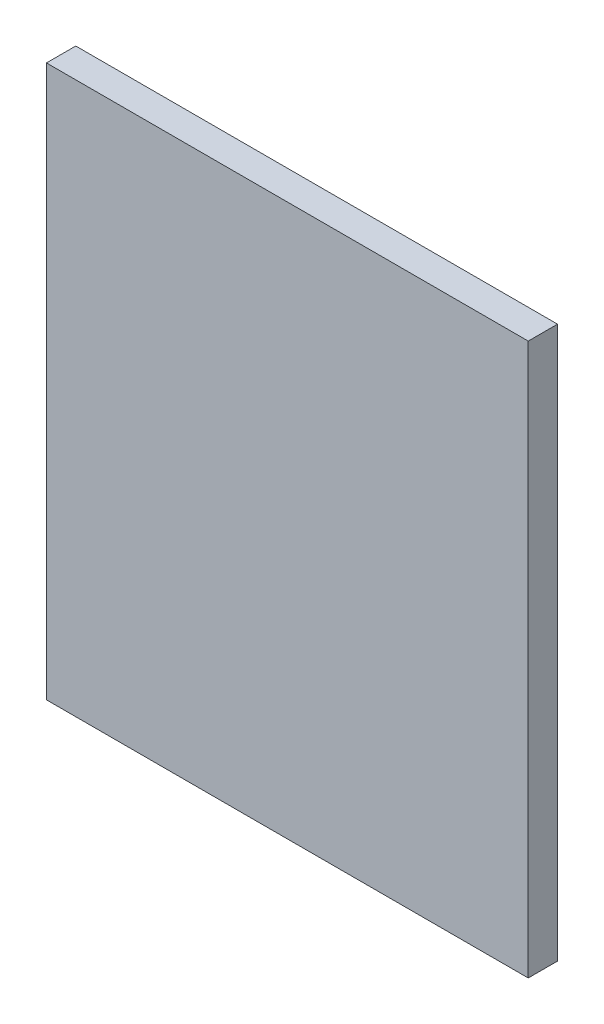
ISO-10303-21;
HEADER;
FILE_DESCRIPTION(('STEP AP214'),'2;1');
FILE_NAME('part.step','',(''),(''),'','','');
FILE_SCHEMA(('AUTOMOTIVE_DESIGN { 1 0 10303 214 1 1 1 1 }'));
ENDSEC;
DATA;
#1=APPLICATION_CONTEXT('core data for automotive mechanical design processes');
#2=APPLICATION_PROTOCOL_DEFINITION('international standard','automotive_design',2000,#1);
#3=PRODUCT_CONTEXT('',#1,'mechanical');
#4=PRODUCT('Part','Part','',(#3));
#5=PRODUCT_RELATED_PRODUCT_CATEGORY('part','',(#4));
#6=PRODUCT_DEFINITION_FORMATION('','',#4);
#7=PRODUCT_DEFINITION_CONTEXT('part definition',#1,'design');
#8=PRODUCT_DEFINITION('design','',#6,#7);
#9=PRODUCT_DEFINITION_SHAPE('','',#8);
#10=(LENGTH_UNIT() NAMED_UNIT(*) SI_UNIT(.MILLI.,.METRE.));
#11=(NAMED_UNIT(*) PLANE_ANGLE_UNIT() SI_UNIT($,.RADIAN.));
#12=(NAMED_UNIT(*) SI_UNIT($,.STERADIAN.) SOLID_ANGLE_UNIT());
#13=UNCERTAINTY_MEASURE_WITH_UNIT(LENGTH_MEASURE(1.E-05),#10,'distance_accuracy_value','');
#14=(GEOMETRIC_REPRESENTATION_CONTEXT(3) GLOBAL_UNCERTAINTY_ASSIGNED_CONTEXT((#13)) GLOBAL_UNIT_ASSIGNED_CONTEXT((#10,
#11,#12)) REPRESENTATION_CONTEXT('',''));
#15=CARTESIAN_POINT('',(0.,0.,0.));
#16=DIRECTION('',(0.,0.,1.));
#17=DIRECTION('',(1.,0.,0.));
#18=AXIS2_PLACEMENT_3D('',#15,#16,#17);
#19=CARTESIAN_POINT('',(-43.4932132571721,38.6076742337637,1.));
#20=DIRECTION('',(1.,0.,0.));
#21=DIRECTION('',(0.,0.,-1.));
#22=AXIS2_PLACEMENT_3D('',#19,#20,#21);
#23=PLANE('',#22);
#24=DIRECTION('',(0.,-1.,0.));
#25=VECTOR('',#24,1.);
#26=CARTESIAN_POINT('',(-43.4932132571721,38.6076742337637,0.));
#27=LINE('',#26,#25);
#28=CARTESIAN_POINT('',(-43.4932132571721,38.6076742337637,0.));
#29=VERTEX_POINT('',#28);
#30=CARTESIAN_POINT('',(-43.4932132571721,19.7804750703851,0.));
#31=VERTEX_POINT('',#30);
#32=EDGE_CURVE('E96',#29,#31,#27,.T.);
#33=ORIENTED_EDGE('',*,*,#32,.T.);
#34=DIRECTION('',(0.,0.,-1.));
#35=VECTOR('',#34,1.);
#36=CARTESIAN_POINT('',(-43.4932132571721,19.7804750703851,1.));
#37=LINE('',#36,#35);
#38=CARTESIAN_POINT('',(-43.4932132571721,19.7804750703851,1.));
#39=VERTEX_POINT('',#38);
#40=EDGE_CURVE('E11',#39,#31,#37,.T.);
#41=ORIENTED_EDGE('',*,*,#40,.F.);
#42=DIRECTION('',(0.,-1.,0.));
#43=VECTOR('',#42,1.);
#44=CARTESIAN_POINT('',(-43.4932132571721,38.6076742337637,1.));
#45=LINE('',#44,#43);
#46=CARTESIAN_POINT('',(-43.4932132571721,38.6076742337637,1.));
#47=VERTEX_POINT('',#46);
#48=EDGE_CURVE('E84',#47,#39,#45,.T.);
#49=ORIENTED_EDGE('',*,*,#48,.F.);
#50=DIRECTION('',(0.,0.,-1.));
#51=VECTOR('',#50,1.);
#52=CARTESIAN_POINT('',(-43.4932132571721,38.6076742337637,1.));
#53=LINE('',#52,#51);
#54=EDGE_CURVE('E92',#47,#29,#53,.T.);
#55=ORIENTED_EDGE('',*,*,#54,.T.);
#56=EDGE_LOOP('',(#33,#41,#49,#55));
#57=FACE_BOUND('',#56,.T.);
#58=ADVANCED_FACE('F33',(#57),#23,.F.);
#59=CARTESIAN_POINT('',(-43.4932132571721,19.7804750703851,1.));
#60=DIRECTION('',(0.,1.,0.));
#61=DIRECTION('',(0.,0.,1.));
#62=AXIS2_PLACEMENT_3D('',#59,#60,#61);
#63=PLANE('',#62);
#64=DIRECTION('',(1.,0.,0.));
#65=VECTOR('',#64,1.);
#66=CARTESIAN_POINT('',(-43.4932132571721,19.7804750703851,0.));
#67=LINE('',#66,#65);
#68=CARTESIAN_POINT('',(-27.0492038613097,19.7804750703851,0.));
#69=VERTEX_POINT('',#68);
#70=EDGE_CURVE('E88',#31,#69,#67,.T.);
#71=ORIENTED_EDGE('',*,*,#70,.T.);
#72=DIRECTION('',(0.,0.,-1.));
#73=VECTOR('',#72,1.);
#74=CARTESIAN_POINT('',(-27.0492038613097,19.7804750703851,1.));
#75=LINE('',#74,#73);
#76=CARTESIAN_POINT('',(-27.0492038613097,19.7804750703851,1.));
#77=VERTEX_POINT('',#76);
#78=EDGE_CURVE('E41',#77,#69,#75,.T.);
#79=ORIENTED_EDGE('',*,*,#78,.F.);
#80=DIRECTION('',(1.,0.,0.));
#81=VECTOR('',#80,1.);
#82=CARTESIAN_POINT('',(-43.4932132571721,19.7804750703851,1.));
#83=LINE('',#82,#81);
#84=EDGE_CURVE('E79',#39,#77,#83,.T.);
#85=ORIENTED_EDGE('',*,*,#84,.F.);
#86=ORIENTED_EDGE('',*,*,#40,.T.);
#87=EDGE_LOOP('',(#71,#79,#85,#86));
#88=FACE_BOUND('',#87,.T.);
#89=ADVANCED_FACE('F87',(#88),#63,.F.);
#90=CARTESIAN_POINT('',(-27.0492038613097,38.6076742337637,1.));
#91=DIRECTION('',(-1.,0.,0.));
#92=DIRECTION('',(0.,0.,1.));
#93=AXIS2_PLACEMENT_3D('',#90,#91,#92);
#94=PLANE('',#93);
#95=DIRECTION('',(0.,1.,0.));
#96=VECTOR('',#95,1.);
#97=CARTESIAN_POINT('',(-27.0492038613097,38.6076742337637,0.));
#98=LINE('',#97,#96);
#99=CARTESIAN_POINT('',(-27.0492038613097,38.6076742337637,0.));
#100=VERTEX_POINT('',#99);
#101=EDGE_CURVE('E66',#69,#100,#98,.T.);
#102=ORIENTED_EDGE('',*,*,#101,.T.);
#103=DIRECTION('',(0.,0.,-1.));
#104=VECTOR('',#103,1.);
#105=CARTESIAN_POINT('',(-27.0492038613097,38.6076742337637,1.));
#106=LINE('',#105,#104);
#107=CARTESIAN_POINT('',(-27.0492038613097,38.6076742337637,1.));
#108=VERTEX_POINT('',#107);
#109=EDGE_CURVE('E89',#108,#100,#106,.T.);
#110=ORIENTED_EDGE('',*,*,#109,.F.);
#111=DIRECTION('',(0.,1.,0.));
#112=VECTOR('',#111,1.);
#113=CARTESIAN_POINT('',(-27.0492038613097,38.6076742337637,1.));
#114=LINE('',#113,#112);
#115=EDGE_CURVE('E82',#77,#108,#114,.T.);
#116=ORIENTED_EDGE('',*,*,#115,.F.);
#117=ORIENTED_EDGE('',*,*,#78,.T.);
#118=EDGE_LOOP('',(#102,#110,#116,#117));
#119=FACE_BOUND('',#118,.T.);
#120=ADVANCED_FACE('F90',(#119),#94,.F.);
#121=CARTESIAN_POINT('',(-43.4932132571721,38.6076742337637,1.));
#122=DIRECTION('',(0.,-1.,0.));
#123=DIRECTION('',(0.,0.,-1.));
#124=AXIS2_PLACEMENT_3D('',#121,#122,#123);
#125=PLANE('',#124);
#126=DIRECTION('',(-1.,0.,0.));
#127=VECTOR('',#126,1.);
#128=CARTESIAN_POINT('',(-43.4932132571721,38.6076742337637,0.));
#129=LINE('',#128,#127);
#130=EDGE_CURVE('E72',#100,#29,#129,.T.);
#131=ORIENTED_EDGE('',*,*,#130,.T.);
#132=ORIENTED_EDGE('',*,*,#54,.F.);
#133=DIRECTION('',(-1.,0.,0.));
#134=VECTOR('',#133,1.);
#135=CARTESIAN_POINT('',(-43.4932132571721,38.6076742337637,1.));
#136=LINE('',#135,#134);
#137=EDGE_CURVE('E49',#108,#47,#136,.T.);
#138=ORIENTED_EDGE('',*,*,#137,.F.);
#139=ORIENTED_EDGE('',*,*,#109,.T.);
#140=EDGE_LOOP('',(#131,#132,#138,#139));
#141=FACE_BOUND('',#140,.T.);
#142=ADVANCED_FACE('F103',(#141),#125,.F.);
#143=CARTESIAN_POINT('',(0.,0.,1.));
#144=DIRECTION('',(0.,0.,1.));
#145=DIRECTION('',(1.,0.,0.));
#146=AXIS2_PLACEMENT_3D('',#143,#144,#145);
#147=PLANE('',#146);
#148=ORIENTED_EDGE('',*,*,#48,.T.);
#149=ORIENTED_EDGE('',*,*,#84,.T.);
#150=ORIENTED_EDGE('',*,*,#115,.T.);
#151=ORIENTED_EDGE('',*,*,#137,.T.);
#152=EDGE_LOOP('',(#148,#149,#150,#151));
#153=FACE_BOUND('',#152,.T.);
#154=ADVANCED_FACE('F80',(#153),#147,.T.);
#155=CARTESIAN_POINT('',(0.,0.,0.));
#156=DIRECTION('',(0.,0.,1.));
#157=DIRECTION('',(1.,0.,0.));
#158=AXIS2_PLACEMENT_3D('',#155,#156,#157);
#159=PLANE('',#158);
#160=ORIENTED_EDGE('',*,*,#32,.F.);
#161=ORIENTED_EDGE('',*,*,#130,.F.);
#162=ORIENTED_EDGE('',*,*,#101,.F.);
#163=ORIENTED_EDGE('',*,*,#70,.F.);
#164=EDGE_LOOP('',(#160,#161,#162,#163));
#165=FACE_BOUND('',#164,.T.);
#166=ADVANCED_FACE('F106',(#165),#159,.F.);
#167=CLOSED_SHELL('',(#58,#89,#120,#142,#154,#166));
#168=MANIFOLD_SOLID_BREP('B2',#167);
#169=ADVANCED_BREP_SHAPE_REPRESENTATION('',(#18,#168),#14);
#170=SHAPE_DEFINITION_REPRESENTATION(#9,#169);
ENDSEC;
END-ISO-10303-21;
